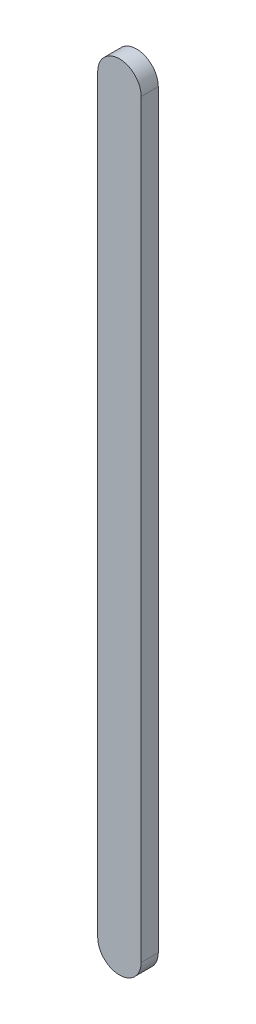
ISO-10303-21;
HEADER;
FILE_DESCRIPTION(('STEP AP214'),'2;1');
FILE_NAME('part.step','',(''),(''),'','','');
FILE_SCHEMA(('AUTOMOTIVE_DESIGN { 1 0 10303 214 1 1 1 1 }'));
ENDSEC;
DATA;
#1=APPLICATION_CONTEXT('core data for automotive mechanical design processes');
#2=APPLICATION_PROTOCOL_DEFINITION('international standard','automotive_design',2000,#1);
#3=PRODUCT_CONTEXT('',#1,'mechanical');
#4=PRODUCT('Part','Part','',(#3));
#5=PRODUCT_RELATED_PRODUCT_CATEGORY('part','',(#4));
#6=PRODUCT_DEFINITION_FORMATION('','',#4);
#7=PRODUCT_DEFINITION_CONTEXT('part definition',#1,'design');
#8=PRODUCT_DEFINITION('design','',#6,#7);
#9=PRODUCT_DEFINITION_SHAPE('','',#8);
#10=(LENGTH_UNIT() NAMED_UNIT(*) SI_UNIT(.MILLI.,.METRE.));
#11=(NAMED_UNIT(*) PLANE_ANGLE_UNIT() SI_UNIT($,.RADIAN.));
#12=(NAMED_UNIT(*) SI_UNIT($,.STERADIAN.) SOLID_ANGLE_UNIT());
#13=UNCERTAINTY_MEASURE_WITH_UNIT(LENGTH_MEASURE(1.E-05),#10,'distance_accuracy_value','');
#14=(GEOMETRIC_REPRESENTATION_CONTEXT(3) GLOBAL_UNCERTAINTY_ASSIGNED_CONTEXT((#13)) GLOBAL_UNIT_ASSIGNED_CONTEXT((#10,
#11,#12)) REPRESENTATION_CONTEXT('',''));
#15=CARTESIAN_POINT('',(0.,0.,0.));
#16=DIRECTION('',(0.,0.,1.));
#17=DIRECTION('',(1.,0.,0.));
#18=AXIS2_PLACEMENT_3D('',#15,#16,#17);
#19=CARTESIAN_POINT('',(92.6846,69.4914028,0.));
#20=DIRECTION('',(-1.,0.,0.));
#21=DIRECTION('',(0.,1.,0.));
#22=AXIS2_PLACEMENT_3D('',#19,#20,#21);
#23=PLANE('',#22);
#24=DIRECTION('',(0.,1.,0.));
#25=VECTOR('',#24,1.);
#26=CARTESIAN_POINT('',(92.6846,69.4914028,0.1999996));
#27=LINE('',#26,#25);
#28=CARTESIAN_POINT('',(92.6846,69.4914028,0.1999996));
#29=VERTEX_POINT('',#28);
#30=CARTESIAN_POINT('',(92.6846,78.2574,0.1999996));
#31=VERTEX_POINT('',#30);
#32=EDGE_CURVE('E11',#29,#31,#27,.T.);
#33=ORIENTED_EDGE('',*,*,#32,.F.);
#34=DIRECTION('',(0.,0.,1.));
#35=VECTOR('',#34,1.);
#36=CARTESIAN_POINT('',(92.6846,69.4914028,0.));
#37=LINE('',#36,#35);
#38=CARTESIAN_POINT('',(92.6846,69.4914028,0.));
#39=VERTEX_POINT('',#38);
#40=EDGE_CURVE('E24',#39,#29,#37,.T.);
#41=ORIENTED_EDGE('',*,*,#40,.F.);
#42=DIRECTION('',(0.,1.,0.));
#43=VECTOR('',#42,1.);
#44=CARTESIAN_POINT('',(92.6846,69.4914028,0.));
#45=LINE('',#44,#43);
#46=CARTESIAN_POINT('',(92.6846,78.2574,0.));
#47=VERTEX_POINT('',#46);
#48=EDGE_CURVE('E75',#39,#47,#45,.T.);
#49=ORIENTED_EDGE('',*,*,#48,.T.);
#50=DIRECTION('',(0.,0.,1.));
#51=VECTOR('',#50,1.);
#52=CARTESIAN_POINT('',(92.6846,78.2574,0.));
#53=LINE('',#52,#51);
#54=EDGE_CURVE('E37',#47,#31,#53,.T.);
#55=ORIENTED_EDGE('',*,*,#54,.T.);
#56=EDGE_LOOP('',(#33,#41,#49,#55));
#57=FACE_BOUND('',#56,.T.);
#58=ADVANCED_FACE('F17',(#57),#23,.F.);
#59=CARTESIAN_POINT('',(92.4306,78.2574,0.));
#60=DIRECTION('',(0.,0.,-1.));
#61=DIRECTION('',(1.,1.11896493820486E-13,0.));
#62=AXIS2_PLACEMENT_3D('',#59,#60,#61);
#63=CYLINDRICAL_SURFACE('',#62,0.25400000000001);
#64=CARTESIAN_POINT('',(92.4306,78.2574,0.1999996));
#65=DIRECTION('',(0.,0.,1.));
#66=DIRECTION('',(1.,1.11896493820486E-13,0.));
#67=AXIS2_PLACEMENT_3D('',#64,#65,#66);
#68=CIRCLE('',#67,0.25400000000001);
#69=CARTESIAN_POINT('',(92.1766,78.2574,0.1999996));
#70=VERTEX_POINT('',#69);
#71=EDGE_CURVE('E83',#31,#70,#68,.T.);
#72=ORIENTED_EDGE('',*,*,#71,.F.);
#73=ORIENTED_EDGE('',*,*,#54,.F.);
#74=CARTESIAN_POINT('',(92.4306,78.2574,0.));
#75=DIRECTION('',(0.,0.,1.));
#76=DIRECTION('',(1.,1.11896493820486E-13,0.));
#77=AXIS2_PLACEMENT_3D('',#74,#75,#76);
#78=CIRCLE('',#77,0.25400000000001);
#79=CARTESIAN_POINT('',(92.1766,78.2574,0.));
#80=VERTEX_POINT('',#79);
#81=EDGE_CURVE('E81',#47,#80,#78,.T.);
#82=ORIENTED_EDGE('',*,*,#81,.T.);
#83=DIRECTION('',(0.,0.,1.));
#84=VECTOR('',#83,1.);
#85=CARTESIAN_POINT('',(92.1766,78.2574,0.));
#86=LINE('',#85,#84);
#87=EDGE_CURVE('E67',#80,#70,#86,.T.);
#88=ORIENTED_EDGE('',*,*,#87,.T.);
#89=EDGE_LOOP('',(#72,#73,#82,#88));
#90=FACE_BOUND('',#89,.T.);
#91=ADVANCED_FACE('F89',(#90),#63,.T.);
#92=CARTESIAN_POINT('',(92.1766,78.2574,0.));
#93=DIRECTION('',(1.,0.,0.));
#94=DIRECTION('',(0.,-1.,0.));
#95=AXIS2_PLACEMENT_3D('',#92,#93,#94);
#96=PLANE('',#95);
#97=DIRECTION('',(0.,-1.,0.));
#98=VECTOR('',#97,1.);
#99=CARTESIAN_POINT('',(92.1766,78.2574,0.1999996));
#100=LINE('',#99,#98);
#101=CARTESIAN_POINT('',(92.1766,69.4914028,0.1999996));
#102=VERTEX_POINT('',#101);
#103=EDGE_CURVE('E71',#70,#102,#100,.T.);
#104=ORIENTED_EDGE('',*,*,#103,.F.);
#105=ORIENTED_EDGE('',*,*,#87,.F.);
#106=DIRECTION('',(0.,-1.,0.));
#107=VECTOR('',#106,1.);
#108=CARTESIAN_POINT('',(92.1766,78.2574,0.));
#109=LINE('',#108,#107);
#110=CARTESIAN_POINT('',(92.1766,69.4914028,0.));
#111=VERTEX_POINT('',#110);
#112=EDGE_CURVE('E63',#80,#111,#109,.T.);
#113=ORIENTED_EDGE('',*,*,#112,.T.);
#114=DIRECTION('',(0.,0.,1.));
#115=VECTOR('',#114,1.);
#116=CARTESIAN_POINT('',(92.1766,69.4914028,0.));
#117=LINE('',#116,#115);
#118=EDGE_CURVE('E53',#111,#102,#117,.T.);
#119=ORIENTED_EDGE('',*,*,#118,.T.);
#120=EDGE_LOOP('',(#104,#105,#113,#119));
#121=FACE_BOUND('',#120,.T.);
#122=ADVANCED_FACE('F66',(#121),#96,.F.);
#123=CARTESIAN_POINT('',(92.4306,69.4914028,0.));
#124=DIRECTION('',(0.,0.,-1.));
#125=DIRECTION('',(-1.,-1.11896493820486E-13,0.));
#126=AXIS2_PLACEMENT_3D('',#123,#124,#125);
#127=CYLINDRICAL_SURFACE('',#126,0.25400000000001);
#128=CARTESIAN_POINT('',(92.4306,69.4914028,0.1999996));
#129=DIRECTION('',(0.,0.,1.));
#130=DIRECTION('',(-1.,-1.11896493820486E-13,0.));
#131=AXIS2_PLACEMENT_3D('',#128,#129,#130);
#132=CIRCLE('',#131,0.25400000000001);
#133=EDGE_CURVE('E59',#102,#29,#132,.T.);
#134=ORIENTED_EDGE('',*,*,#133,.F.);
#135=ORIENTED_EDGE('',*,*,#118,.F.);
#136=CARTESIAN_POINT('',(92.4306,69.4914028,0.));
#137=DIRECTION('',(0.,0.,1.));
#138=DIRECTION('',(-1.,-1.11896493820486E-13,0.));
#139=AXIS2_PLACEMENT_3D('',#136,#137,#138);
#140=CIRCLE('',#139,0.25400000000001);
#141=EDGE_CURVE('E57',#111,#39,#140,.T.);
#142=ORIENTED_EDGE('',*,*,#141,.T.);
#143=ORIENTED_EDGE('',*,*,#40,.T.);
#144=EDGE_LOOP('',(#134,#135,#142,#143));
#145=FACE_BOUND('',#144,.T.);
#146=ADVANCED_FACE('F55',(#145),#127,.T.);
#147=CARTESIAN_POINT('',(92.6846,69.4914028,0.));
#148=DIRECTION('',(0.,0.,-1.));
#149=DIRECTION('',(-1.,0.,0.));
#150=AXIS2_PLACEMENT_3D('',#147,#148,#149);
#151=PLANE('',#150);
#152=ORIENTED_EDGE('',*,*,#141,.F.);
#153=ORIENTED_EDGE('',*,*,#112,.F.);
#154=ORIENTED_EDGE('',*,*,#81,.F.);
#155=ORIENTED_EDGE('',*,*,#48,.F.);
#156=EDGE_LOOP('',(#152,#153,#154,#155));
#157=FACE_BOUND('',#156,.T.);
#158=ADVANCED_FACE('F74',(#157),#151,.T.);
#159=CARTESIAN_POINT('',(92.6846,69.4914028,0.1999996));
#160=DIRECTION('',(0.,0.,-1.));
#161=DIRECTION('',(-1.,0.,0.));
#162=AXIS2_PLACEMENT_3D('',#159,#160,#161);
#163=PLANE('',#162);
#164=ORIENTED_EDGE('',*,*,#32,.T.);
#165=ORIENTED_EDGE('',*,*,#71,.T.);
#166=ORIENTED_EDGE('',*,*,#103,.T.);
#167=ORIENTED_EDGE('',*,*,#133,.T.);
#168=EDGE_LOOP('',(#164,#165,#166,#167));
#169=FACE_BOUND('',#168,.T.);
#170=ADVANCED_FACE('F91',(#169),#163,.F.);
#171=CLOSED_SHELL('',(#58,#91,#122,#146,#158,#170));
#172=MANIFOLD_SOLID_BREP('B1',#171);
#173=ADVANCED_BREP_SHAPE_REPRESENTATION('',(#18,#172),#14);
#174=SHAPE_DEFINITION_REPRESENTATION(#9,#173);
ENDSEC;
END-ISO-10303-21;
